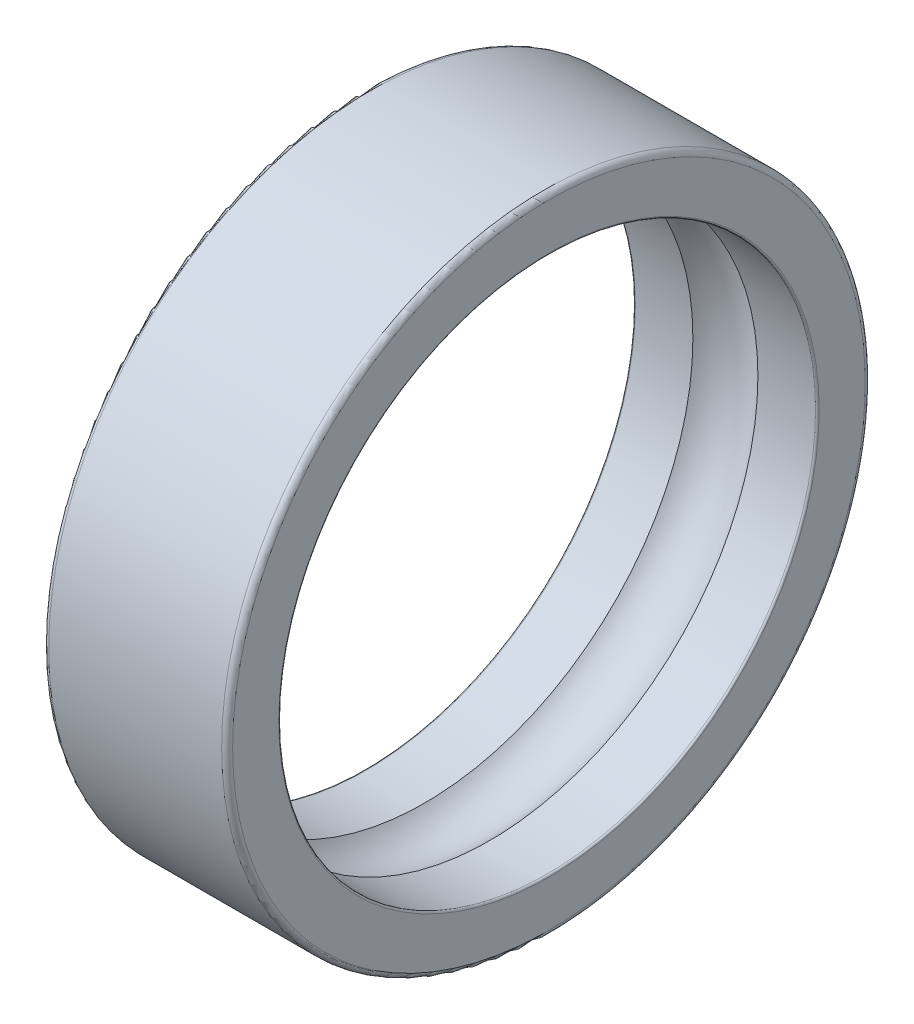
ISO-10303-21;
HEADER;
FILE_DESCRIPTION(('STEP AP214'),'2;1');
FILE_NAME('part.step','',(''),(''),'','','');
FILE_SCHEMA(('AUTOMOTIVE_DESIGN { 1 0 10303 214 1 1 1 1 }'));
ENDSEC;
DATA;
#1=APPLICATION_CONTEXT('core data for automotive mechanical design processes');
#2=APPLICATION_PROTOCOL_DEFINITION('international standard','automotive_design',2000,#1);
#3=PRODUCT_CONTEXT('',#1,'mechanical');
#4=PRODUCT('Part','Part','',(#3));
#5=PRODUCT_RELATED_PRODUCT_CATEGORY('part','',(#4));
#6=PRODUCT_DEFINITION_FORMATION('','',#4);
#7=PRODUCT_DEFINITION_CONTEXT('part definition',#1,'design');
#8=PRODUCT_DEFINITION('design','',#6,#7);
#9=PRODUCT_DEFINITION_SHAPE('','',#8);
#10=(LENGTH_UNIT() NAMED_UNIT(*) SI_UNIT(.MILLI.,.METRE.));
#11=(NAMED_UNIT(*) PLANE_ANGLE_UNIT() SI_UNIT($,.RADIAN.));
#12=(NAMED_UNIT(*) SI_UNIT($,.STERADIAN.) SOLID_ANGLE_UNIT());
#13=UNCERTAINTY_MEASURE_WITH_UNIT(LENGTH_MEASURE(1.E-05),#10,'distance_accuracy_value','');
#14=(GEOMETRIC_REPRESENTATION_CONTEXT(3) GLOBAL_UNCERTAINTY_ASSIGNED_CONTEXT((#13)) GLOBAL_UNIT_ASSIGNED_CONTEXT((#10,
#11,#12)) REPRESENTATION_CONTEXT('',''));
#15=CARTESIAN_POINT('',(0.,0.,0.));
#16=DIRECTION('',(0.,0.,1.));
#17=DIRECTION('',(1.,0.,0.));
#18=AXIS2_PLACEMENT_3D('',#15,#16,#17);
#19=CARTESIAN_POINT('',(0.299999999999941,0.,0.));
#20=DIRECTION('',(-1.,0.,0.));
#21=DIRECTION('',(0.,0.,1.));
#22=AXIS2_PLACEMENT_3D('',#19,#20,#21);
#23=TOROIDAL_SURFACE('',#22,17.2000000000001,0.29999999999994);
#24=CARTESIAN_POINT('',(0.,0.,0.));
#25=DIRECTION('',(-1.,0.,0.));
#26=DIRECTION('',(0.,0.,1.));
#27=AXIS2_PLACEMENT_3D('',#24,#25,#26);
#28=CIRCLE('',#27,17.2);
#29=CARTESIAN_POINT('',(0.,0.,17.2));
#30=VERTEX_POINT('',#29);
#31=EDGE_CURVE('E10',#30,#30,#28,.T.);
#32=ORIENTED_EDGE('',*,*,#31,.F.);
#33=EDGE_LOOP('',(#32));
#34=FACE_BOUND('',#33,.T.);
#35=CARTESIAN_POINT('',(0.300000000000002,0.,0.));
#36=DIRECTION('',(-1.,0.,0.));
#37=DIRECTION('',(0.,0.,1.));
#38=AXIS2_PLACEMENT_3D('',#35,#36,#37);
#39=CIRCLE('',#38,17.5);
#40=CARTESIAN_POINT('',(0.300000000000002,0.,17.5));
#41=VERTEX_POINT('',#40);
#42=EDGE_CURVE('E64',#41,#41,#39,.T.);
#43=ORIENTED_EDGE('',*,*,#42,.T.);
#44=EDGE_LOOP('',(#43));
#45=FACE_BOUND('',#44,.T.);
#46=ADVANCED_FACE('F30',(#34,#45),#23,.T.);
#47=CARTESIAN_POINT('',(0.,17.2,0.));
#48=DIRECTION('',(1.,0.,0.));
#49=DIRECTION('',(0.,0.,-1.));
#50=AXIS2_PLACEMENT_3D('',#47,#48,#49);
#51=PLANE('',#50);
#52=CARTESIAN_POINT('',(0.,0.,0.));
#53=DIRECTION('',(-1.,0.,0.));
#54=DIRECTION('',(0.,0.,1.));
#55=AXIS2_PLACEMENT_3D('',#52,#53,#54);
#56=CIRCLE('',#55,14.695);
#57=CARTESIAN_POINT('',(0.,0.,14.695));
#58=VERTEX_POINT('',#57);
#59=EDGE_CURVE('E36',#58,#58,#56,.T.);
#60=ORIENTED_EDGE('',*,*,#59,.F.);
#61=EDGE_LOOP('',(#60));
#62=FACE_BOUND('',#61,.T.);
#63=ORIENTED_EDGE('',*,*,#31,.T.);
#64=EDGE_LOOP('',(#63));
#65=FACE_BOUND('',#64,.T.);
#66=ADVANCED_FACE('F113',(#62,#65),#51,.F.);
#67=CARTESIAN_POINT('',(0.0999999999994091,0.,0.));
#68=DIRECTION('',(-1.,0.,0.));
#69=DIRECTION('',(0.,0.,1.));
#70=AXIS2_PLACEMENT_3D('',#67,#68,#69);
#71=TOROIDAL_SURFACE('',#70,14.6949999999994,0.0999999999994093);
#72=CARTESIAN_POINT('',(0.100000000000003,0.,0.));
#73=DIRECTION('',(-1.,0.,0.));
#74=DIRECTION('',(0.,0.,1.));
#75=AXIS2_PLACEMENT_3D('',#72,#73,#74);
#76=CIRCLE('',#75,14.595);
#77=CARTESIAN_POINT('',(0.100000000000003,0.,14.595));
#78=VERTEX_POINT('',#77);
#79=EDGE_CURVE('E40',#78,#78,#76,.T.);
#80=ORIENTED_EDGE('',*,*,#79,.F.);
#81=EDGE_LOOP('',(#80));
#82=FACE_BOUND('',#81,.T.);
#83=ORIENTED_EDGE('',*,*,#59,.T.);
#84=EDGE_LOOP('',(#83));
#85=FACE_BOUND('',#84,.T.);
#86=ADVANCED_FACE('F108',(#82,#85),#71,.T.);
#87=CARTESIAN_POINT('',(50.,0.,0.));
#88=DIRECTION('',(-1.,0.,0.));
#89=DIRECTION('',(0.,0.,1.));
#90=AXIS2_PLACEMENT_3D('',#87,#88,#89);
#91=CYLINDRICAL_SURFACE('',#90,14.595);
#92=CARTESIAN_POINT('',(3.2321945808432,0.,0.));
#93=DIRECTION('',(-1.,0.,0.));
#94=DIRECTION('',(0.,0.,1.));
#95=AXIS2_PLACEMENT_3D('',#92,#93,#94);
#96=CIRCLE('',#95,14.595);
#97=CARTESIAN_POINT('',(3.2321945808432,0.,14.595));
#98=VERTEX_POINT('',#97);
#99=EDGE_CURVE('E44',#98,#98,#96,.T.);
#100=ORIENTED_EDGE('',*,*,#99,.F.);
#101=EDGE_LOOP('',(#100));
#102=FACE_BOUND('',#101,.T.);
#103=ORIENTED_EDGE('',*,*,#79,.T.);
#104=EDGE_LOOP('',(#103));
#105=FACE_BOUND('',#104,.T.);
#106=ADVANCED_FACE('F102',(#102,#105),#91,.F.);
#107=CARTESIAN_POINT('',(5.,0.,0.));
#108=DIRECTION('',(-1.,0.,0.));
#109=DIRECTION('',(0.,0.,1.));
#110=AXIS2_PLACEMENT_3D('',#107,#108,#109);
#111=TOROIDAL_SURFACE('',#110,12.9999999999999,2.3810000000001);
#112=CARTESIAN_POINT('',(6.7678054191568,0.,0.));
#113=DIRECTION('',(-1.,0.,0.));
#114=DIRECTION('',(0.,0.,1.));
#115=AXIS2_PLACEMENT_3D('',#112,#113,#114);
#116=CIRCLE('',#115,14.595);
#117=CARTESIAN_POINT('',(6.7678054191568,0.,14.595));
#118=VERTEX_POINT('',#117);
#119=EDGE_CURVE('E49',#118,#118,#116,.T.);
#120=ORIENTED_EDGE('',*,*,#119,.F.);
#121=EDGE_LOOP('',(#120));
#122=FACE_BOUND('',#121,.T.);
#123=ORIENTED_EDGE('',*,*,#99,.T.);
#124=EDGE_LOOP('',(#123));
#125=FACE_BOUND('',#124,.T.);
#126=ADVANCED_FACE('F96',(#122,#125),#111,.F.);
#127=CARTESIAN_POINT('',(50.,0.,0.));
#128=DIRECTION('',(-1.,0.,0.));
#129=DIRECTION('',(0.,0.,1.));
#130=AXIS2_PLACEMENT_3D('',#127,#128,#129);
#131=CYLINDRICAL_SURFACE('',#130,14.595);
#132=CARTESIAN_POINT('',(9.9,0.,0.));
#133=DIRECTION('',(-1.,0.,0.));
#134=DIRECTION('',(0.,0.,1.));
#135=AXIS2_PLACEMENT_3D('',#132,#133,#134);
#136=CIRCLE('',#135,14.595);
#137=CARTESIAN_POINT('',(9.9,0.,14.595));
#138=VERTEX_POINT('',#137);
#139=EDGE_CURVE('E52',#138,#138,#136,.T.);
#140=ORIENTED_EDGE('',*,*,#139,.F.);
#141=EDGE_LOOP('',(#140));
#142=FACE_BOUND('',#141,.T.);
#143=ORIENTED_EDGE('',*,*,#119,.T.);
#144=EDGE_LOOP('',(#143));
#145=FACE_BOUND('',#144,.T.);
#146=ADVANCED_FACE('F90',(#142,#145),#131,.F.);
#147=CARTESIAN_POINT('',(9.90000000000067,0.,0.));
#148=DIRECTION('',(-1.,0.,0.));
#149=DIRECTION('',(0.,0.,1.));
#150=AXIS2_PLACEMENT_3D('',#147,#148,#149);
#151=TOROIDAL_SURFACE('',#150,14.6949999999993,0.0999999999993324);
#152=CARTESIAN_POINT('',(9.99999999999999,0.,0.));
#153=DIRECTION('',(-1.,0.,0.));
#154=DIRECTION('',(0.,0.,1.));
#155=AXIS2_PLACEMENT_3D('',#152,#153,#154);
#156=CIRCLE('',#155,14.695);
#157=CARTESIAN_POINT('',(9.99999999999999,0.,14.695));
#158=VERTEX_POINT('',#157);
#159=EDGE_CURVE('E55',#158,#158,#156,.T.);
#160=ORIENTED_EDGE('',*,*,#159,.F.);
#161=EDGE_LOOP('',(#160));
#162=FACE_BOUND('',#161,.T.);
#163=ORIENTED_EDGE('',*,*,#139,.T.);
#164=EDGE_LOOP('',(#163));
#165=FACE_BOUND('',#164,.T.);
#166=ADVANCED_FACE('F84',(#162,#165),#151,.T.);
#167=CARTESIAN_POINT('',(10.,14.695,0.));
#168=DIRECTION('',(-1.,0.,0.));
#169=DIRECTION('',(0.,0.,1.));
#170=AXIS2_PLACEMENT_3D('',#167,#168,#169);
#171=PLANE('',#170);
#172=CARTESIAN_POINT('',(10.,0.,0.));
#173=DIRECTION('',(-1.,0.,0.));
#174=DIRECTION('',(0.,0.,1.));
#175=AXIS2_PLACEMENT_3D('',#172,#173,#174);
#176=CIRCLE('',#175,17.2);
#177=CARTESIAN_POINT('',(10.,0.,17.2));
#178=VERTEX_POINT('',#177);
#179=EDGE_CURVE('E58',#178,#178,#176,.T.);
#180=ORIENTED_EDGE('',*,*,#179,.F.);
#181=EDGE_LOOP('',(#180));
#182=FACE_BOUND('',#181,.T.);
#183=ORIENTED_EDGE('',*,*,#159,.T.);
#184=EDGE_LOOP('',(#183));
#185=FACE_BOUND('',#184,.T.);
#186=ADVANCED_FACE('F78',(#182,#185),#171,.F.);
#187=CARTESIAN_POINT('',(9.70000000000012,0.,0.));
#188=DIRECTION('',(-1.,0.,0.));
#189=DIRECTION('',(0.,0.,1.));
#190=AXIS2_PLACEMENT_3D('',#187,#188,#189);
#191=TOROIDAL_SURFACE('',#190,17.2000000000001,0.29999999999988);
#192=CARTESIAN_POINT('',(9.7,0.,0.));
#193=DIRECTION('',(-1.,0.,0.));
#194=DIRECTION('',(0.,0.,1.));
#195=AXIS2_PLACEMENT_3D('',#192,#193,#194);
#196=CIRCLE('',#195,17.5);
#197=CARTESIAN_POINT('',(9.7,0.,17.5));
#198=VERTEX_POINT('',#197);
#199=EDGE_CURVE('E61',#198,#198,#196,.T.);
#200=ORIENTED_EDGE('',*,*,#199,.F.);
#201=EDGE_LOOP('',(#200));
#202=FACE_BOUND('',#201,.T.);
#203=ORIENTED_EDGE('',*,*,#179,.T.);
#204=EDGE_LOOP('',(#203));
#205=FACE_BOUND('',#204,.T.);
#206=ADVANCED_FACE('F72',(#202,#205),#191,.T.);
#207=CARTESIAN_POINT('',(50.,0.,0.));
#208=DIRECTION('',(-1.,0.,0.));
#209=DIRECTION('',(0.,0.,1.));
#210=AXIS2_PLACEMENT_3D('',#207,#208,#209);
#211=CYLINDRICAL_SURFACE('',#210,17.5);
#212=ORIENTED_EDGE('',*,*,#42,.F.);
#213=EDGE_LOOP('',(#212));
#214=FACE_BOUND('',#213,.T.);
#215=ORIENTED_EDGE('',*,*,#199,.T.);
#216=EDGE_LOOP('',(#215));
#217=FACE_BOUND('',#216,.T.);
#218=ADVANCED_FACE('F69',(#214,#217),#211,.T.);
#219=CLOSED_SHELL('',(#46,#66,#86,#106,#126,#146,#166,#186,#206,#218));
#220=MANIFOLD_SOLID_BREP('B2',#219);
#221=ADVANCED_BREP_SHAPE_REPRESENTATION('',(#18,#220),#14);
#222=SHAPE_DEFINITION_REPRESENTATION(#9,#221);
ENDSEC;
END-ISO-10303-21;
